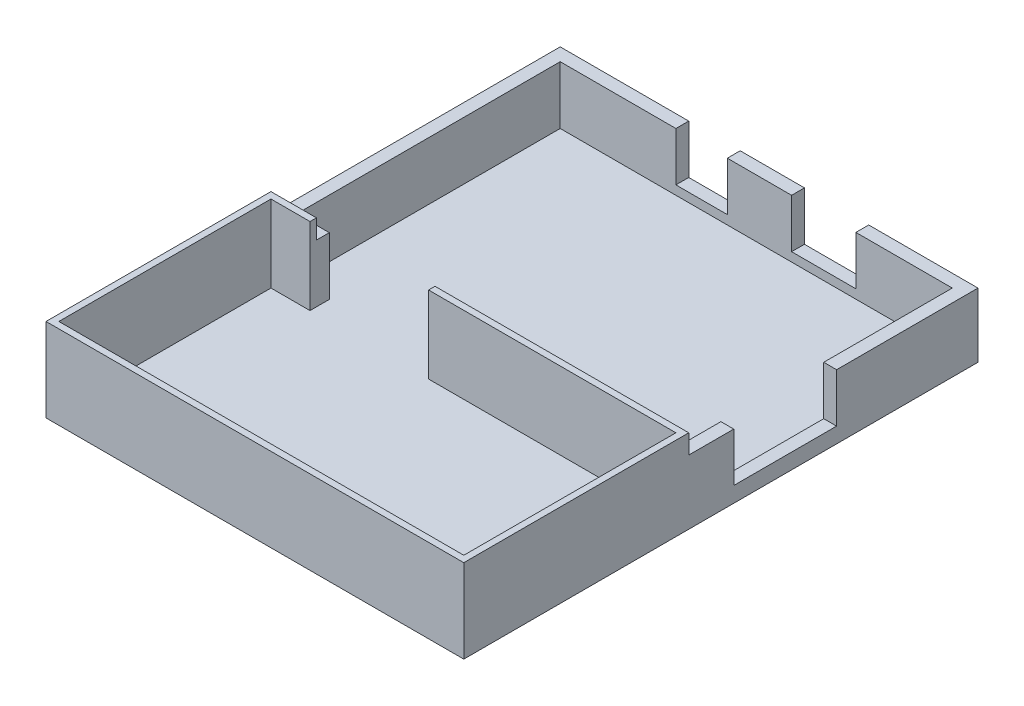
ISO-10303-21;
HEADER;
FILE_DESCRIPTION(('STEP AP214'),'2;1');
FILE_NAME('part.step','',(''),(''),'','','');
FILE_SCHEMA(('AUTOMOTIVE_DESIGN { 1 0 10303 214 1 1 1 1 }'));
ENDSEC;
DATA;
#1=APPLICATION_CONTEXT('core data for automotive mechanical design processes');
#2=APPLICATION_PROTOCOL_DEFINITION('international standard','automotive_design',2000,#1);
#3=PRODUCT_CONTEXT('',#1,'mechanical');
#4=PRODUCT('Part','Part','',(#3));
#5=PRODUCT_RELATED_PRODUCT_CATEGORY('part','',(#4));
#6=PRODUCT_DEFINITION_FORMATION('','',#4);
#7=PRODUCT_DEFINITION_CONTEXT('part definition',#1,'design');
#8=PRODUCT_DEFINITION('design','',#6,#7);
#9=PRODUCT_DEFINITION_SHAPE('','',#8);
#10=(LENGTH_UNIT() NAMED_UNIT(*) SI_UNIT(.MILLI.,.METRE.));
#11=(NAMED_UNIT(*) PLANE_ANGLE_UNIT() SI_UNIT($,.RADIAN.));
#12=(NAMED_UNIT(*) SI_UNIT($,.STERADIAN.) SOLID_ANGLE_UNIT());
#13=UNCERTAINTY_MEASURE_WITH_UNIT(LENGTH_MEASURE(1.E-05),#10,'distance_accuracy_value','');
#14=(GEOMETRIC_REPRESENTATION_CONTEXT(3) GLOBAL_UNCERTAINTY_ASSIGNED_CONTEXT((#13)) GLOBAL_UNIT_ASSIGNED_CONTEXT((#10,
#11,#12)) REPRESENTATION_CONTEXT('',''));
#15=CARTESIAN_POINT('',(0.,0.,0.));
#16=DIRECTION('',(0.,0.,1.));
#17=DIRECTION('',(1.,0.,0.));
#18=AXIS2_PLACEMENT_3D('',#15,#16,#17);
#19=CARTESIAN_POINT('',(0.,10.,0.));
#20=DIRECTION('',(0.,-1.,0.));
#21=DIRECTION('',(0.,0.,-1.));
#22=AXIS2_PLACEMENT_3D('',#19,#20,#21);
#23=PLANE('',#22);
#24=DIRECTION('',(-1.,0.,0.));
#25=VECTOR('',#24,1.);
#26=CARTESIAN_POINT('',(30.5,10.,20.5));
#27=LINE('',#26,#25);
#28=CARTESIAN_POINT('',(30.5,10.,20.5));
#29=VERTEX_POINT('',#28);
#30=CARTESIAN_POINT('',(-6.97753872923101,10.,20.5));
#31=VERTEX_POINT('',#30);
#32=EDGE_CURVE('E402',#29,#31,#27,.T.);
#33=ORIENTED_EDGE('',*,*,#32,.T.);
#34=DIRECTION('',(0.,0.,1.));
#35=VECTOR('',#34,1.);
#36=CARTESIAN_POINT('',(-6.97753872923101,10.,0.));
#37=LINE('',#36,#35);
#38=CARTESIAN_POINT('',(-6.97753872923101,10.,22.5));
#39=VERTEX_POINT('',#38);
#40=EDGE_CURVE('E469',#31,#39,#37,.T.);
#41=ORIENTED_EDGE('',*,*,#40,.T.);
#42=DIRECTION('',(-1.,0.,0.));
#43=VECTOR('',#42,1.);
#44=CARTESIAN_POINT('',(32.5,10.,22.5));
#45=LINE('',#44,#43);
#46=CARTESIAN_POINT('',(32.5,10.,22.5));
#47=VERTEX_POINT('',#46);
#48=EDGE_CURVE('E434',#47,#39,#45,.T.);
#49=ORIENTED_EDGE('',*,*,#48,.F.);
#50=DIRECTION('',(0.,0.,1.));
#51=VECTOR('',#50,1.);
#52=CARTESIAN_POINT('',(32.5,10.,-22.5));
#53=LINE('',#52,#51);
#54=CARTESIAN_POINT('',(32.5,10.,15.5));
#55=VERTEX_POINT('',#54);
#56=EDGE_CURVE('E428',#55,#47,#53,.T.);
#57=ORIENTED_EDGE('',*,*,#56,.F.);
#58=DIRECTION('',(1.,0.,0.));
#59=VECTOR('',#58,1.);
#60=CARTESIAN_POINT('',(32.5,10.,15.5));
#61=LINE('',#60,#59);
#62=CARTESIAN_POINT('',(30.5,10.,15.5));
#63=VERTEX_POINT('',#62);
#64=EDGE_CURVE('E317',#63,#55,#61,.T.);
#65=ORIENTED_EDGE('',*,*,#64,.F.);
#66=DIRECTION('',(0.,0.,1.));
#67=VECTOR('',#66,1.);
#68=CARTESIAN_POINT('',(30.5,10.,-20.5));
#69=LINE('',#68,#67);
#70=EDGE_CURVE('E396',#63,#29,#69,.T.);
#71=ORIENTED_EDGE('',*,*,#70,.T.);
#72=EDGE_LOOP('',(#33,#41,#49,#57,#65,#71));
#73=FACE_BOUND('',#72,.T.);
#74=ADVANCED_FACE('F36',(#73),#23,.F.);
#75=CARTESIAN_POINT('',(30.5,10.,20.5));
#76=DIRECTION('',(0.,0.,1.));
#77=DIRECTION('',(1.,0.,0.));
#78=AXIS2_PLACEMENT_3D('',#75,#76,#77);
#79=PLANE('',#78);
#80=DIRECTION('',(1.,0.,0.));
#81=VECTOR('',#80,1.);
#82=CARTESIAN_POINT('',(-30.5,1.,20.5));
#83=LINE('',#82,#81);
#84=CARTESIAN_POINT('',(-6.97753872923101,1.,20.5));
#85=VERTEX_POINT('',#84);
#86=CARTESIAN_POINT('',(30.5,0.999999999999999,20.5));
#87=VERTEX_POINT('',#86);
#88=EDGE_CURVE('E44',#85,#87,#83,.T.);
#89=ORIENTED_EDGE('',*,*,#88,.F.);
#90=DIRECTION('',(0.,1.,0.));
#91=VECTOR('',#90,1.);
#92=CARTESIAN_POINT('',(-6.97753872923101,10.,20.5));
#93=LINE('',#92,#91);
#94=EDGE_CURVE('E251',#85,#31,#93,.T.);
#95=ORIENTED_EDGE('',*,*,#94,.T.);
#96=ORIENTED_EDGE('',*,*,#32,.F.);
#97=DIRECTION('',(0.,-1.,0.));
#98=VECTOR('',#97,1.);
#99=CARTESIAN_POINT('',(30.5,10.,20.5));
#100=LINE('',#99,#98);
#101=EDGE_CURVE('E416',#29,#87,#100,.T.);
#102=ORIENTED_EDGE('',*,*,#101,.T.);
#103=EDGE_LOOP('',(#89,#95,#96,#102));
#104=FACE_BOUND('',#103,.T.);
#105=ADVANCED_FACE('F465',(#104),#79,.F.);
#106=CARTESIAN_POINT('',(32.5,13.,22.5));
#107=DIRECTION('',(0.,0.,1.));
#108=DIRECTION('',(1.,0.,0.));
#109=AXIS2_PLACEMENT_3D('',#106,#107,#108);
#110=PLANE('',#109);
#111=ORIENTED_EDGE('',*,*,#48,.T.);
#112=DIRECTION('',(0.,1.,0.));
#113=VECTOR('',#112,1.);
#114=CARTESIAN_POINT('',(-6.97753872923101,13.,22.5));
#115=LINE('',#114,#113);
#116=CARTESIAN_POINT('',(-6.97753872923101,13.,22.5));
#117=VERTEX_POINT('',#116);
#118=EDGE_CURVE('E525',#39,#117,#115,.T.);
#119=ORIENTED_EDGE('',*,*,#118,.T.);
#120=DIRECTION('',(-1.,0.,0.));
#121=VECTOR('',#120,1.);
#122=CARTESIAN_POINT('',(32.5,13.,22.5));
#123=LINE('',#122,#121);
#124=CARTESIAN_POINT('',(32.5,13.,22.5));
#125=VERTEX_POINT('',#124);
#126=EDGE_CURVE('E294',#125,#117,#123,.T.);
#127=ORIENTED_EDGE('',*,*,#126,.F.);
#128=DIRECTION('',(0.,-1.,0.));
#129=VECTOR('',#128,1.);
#130=CARTESIAN_POINT('',(32.5,13.,22.5));
#131=LINE('',#130,#129);
#132=EDGE_CURVE('E306',#125,#47,#131,.T.);
#133=ORIENTED_EDGE('',*,*,#132,.T.);
#134=EDGE_LOOP('',(#111,#119,#127,#133));
#135=FACE_BOUND('',#134,.T.);
#136=ADVANCED_FACE('F539',(#135),#110,.F.);
#137=CARTESIAN_POINT('',(31.5,13.,23.5));
#138=DIRECTION('',(0.,0.,1.));
#139=DIRECTION('',(1.,0.,0.));
#140=AXIS2_PLACEMENT_3D('',#137,#138,#139);
#141=PLANE('',#140);
#142=DIRECTION('',(0.,1.,0.));
#143=VECTOR('',#142,1.);
#144=CARTESIAN_POINT('',(-6.97753872923101,-18.9614038762088,23.5));
#145=LINE('',#144,#143);
#146=CARTESIAN_POINT('',(-6.97753872923101,1.,23.5));
#147=VERTEX_POINT('',#146);
#148=CARTESIAN_POINT('',(-6.97753872923101,13.,23.5));
#149=VERTEX_POINT('',#148);
#150=EDGE_CURVE('E248',#147,#149,#145,.T.);
#151=ORIENTED_EDGE('',*,*,#150,.F.);
#152=DIRECTION('',(-1.,0.,0.));
#153=VECTOR('',#152,1.);
#154=CARTESIAN_POINT('',(31.5,0.999999999999999,23.5));
#155=LINE('',#154,#153);
#156=CARTESIAN_POINT('',(31.5,0.999999999999999,23.5));
#157=VERTEX_POINT('',#156);
#158=EDGE_CURVE('E260',#157,#147,#155,.T.);
#159=ORIENTED_EDGE('',*,*,#158,.F.);
#160=DIRECTION('',(0.,-1.,0.));
#161=VECTOR('',#160,1.);
#162=CARTESIAN_POINT('',(31.5,13.,23.5));
#163=LINE('',#162,#161);
#164=CARTESIAN_POINT('',(31.5,13.,23.5));
#165=VERTEX_POINT('',#164);
#166=EDGE_CURVE('E59',#165,#157,#163,.T.);
#167=ORIENTED_EDGE('',*,*,#166,.F.);
#168=DIRECTION('',(-1.,0.,0.));
#169=VECTOR('',#168,1.);
#170=CARTESIAN_POINT('',(31.5,13.,23.5));
#171=LINE('',#170,#169);
#172=EDGE_CURVE('E263',#165,#149,#171,.T.);
#173=ORIENTED_EDGE('',*,*,#172,.T.);
#174=EDGE_LOOP('',(#151,#159,#167,#173));
#175=FACE_BOUND('',#174,.T.);
#176=ADVANCED_FACE('F259',(#175),#141,.T.);
#177=CARTESIAN_POINT('',(30.5,10.,-20.5));
#178=VERTEX_POINT('',#177);
#179=CARTESIAN_POINT('',(30.5,10.,-0.5));
#180=VERTEX_POINT('',#179);
#181=EDGE_CURVE('E398',#178,#180,#69,.T.);
#182=ORIENTED_EDGE('',*,*,#181,.T.);
#183=DIRECTION('',(-1.,0.,0.));
#184=VECTOR('',#183,1.);
#185=CARTESIAN_POINT('',(32.5,10.,-0.5));
#186=LINE('',#185,#184);
#187=CARTESIAN_POINT('',(32.5,10.,-0.5));
#188=VERTEX_POINT('',#187);
#189=EDGE_CURVE('E316',#188,#180,#186,.T.);
#190=ORIENTED_EDGE('',*,*,#189,.F.);
#191=CARTESIAN_POINT('',(32.5,10.,-22.5));
#192=VERTEX_POINT('',#191);
#193=EDGE_CURVE('E430',#192,#188,#53,.T.);
#194=ORIENTED_EDGE('',*,*,#193,.F.);
#195=DIRECTION('',(1.,0.,0.));
#196=VECTOR('',#195,1.);
#197=CARTESIAN_POINT('',(-32.5,10.,-22.5));
#198=LINE('',#197,#196);
#199=CARTESIAN_POINT('',(15.5,10.,-22.5));
#200=VERTEX_POINT('',#199);
#201=EDGE_CURVE('E423',#200,#192,#198,.T.);
#202=ORIENTED_EDGE('',*,*,#201,.F.);
#203=DIRECTION('',(0.,0.,-1.));
#204=VECTOR('',#203,1.);
#205=CARTESIAN_POINT('',(15.5,10.,-22.5));
#206=LINE('',#205,#204);
#207=CARTESIAN_POINT('',(15.5,10.,-20.5));
#208=VERTEX_POINT('',#207);
#209=EDGE_CURVE('E343',#208,#200,#206,.T.);
#210=ORIENTED_EDGE('',*,*,#209,.F.);
#211=DIRECTION('',(1.,0.,0.));
#212=VECTOR('',#211,1.);
#213=CARTESIAN_POINT('',(-30.5,10.,-20.5));
#214=LINE('',#213,#212);
#215=EDGE_CURVE('E392',#208,#178,#214,.T.);
#216=ORIENTED_EDGE('',*,*,#215,.T.);
#217=EDGE_LOOP('',(#182,#190,#194,#202,#210,#216));
#218=FACE_BOUND('',#217,.T.);
#219=ADVANCED_FACE('F483',(#218),#23,.F.);
#220=CARTESIAN_POINT('',(-25.428302151596,10.,22.5));
#221=VERTEX_POINT('',#220);
#222=CARTESIAN_POINT('',(-32.5,10.,22.5));
#223=VERTEX_POINT('',#222);
#224=EDGE_CURVE('E433',#221,#223,#45,.T.);
#225=ORIENTED_EDGE('',*,*,#224,.F.);
#226=DIRECTION('',(0.,0.,-1.));
#227=VECTOR('',#226,1.);
#228=CARTESIAN_POINT('',(-25.428302151596,10.,0.));
#229=LINE('',#228,#227);
#230=CARTESIAN_POINT('',(-25.428302151596,10.,20.5));
#231=VERTEX_POINT('',#230);
#232=EDGE_CURVE('E529',#221,#231,#229,.T.);
#233=ORIENTED_EDGE('',*,*,#232,.T.);
#234=CARTESIAN_POINT('',(-30.5,10.,20.5));
#235=VERTEX_POINT('',#234);
#236=EDGE_CURVE('E401',#231,#235,#27,.T.);
#237=ORIENTED_EDGE('',*,*,#236,.T.);
#238=DIRECTION('',(0.,0.,-1.));
#239=VECTOR('',#238,1.);
#240=CARTESIAN_POINT('',(-30.5,10.,20.5));
#241=LINE('',#240,#239);
#242=CARTESIAN_POINT('',(-30.5,10.,-20.5));
#243=VERTEX_POINT('',#242);
#244=EDGE_CURVE('E405',#235,#243,#241,.T.);
#245=ORIENTED_EDGE('',*,*,#244,.T.);
#246=CARTESIAN_POINT('',(-12.5,10.,-20.5));
#247=VERTEX_POINT('',#246);
#248=EDGE_CURVE('E393',#243,#247,#214,.T.);
#249=ORIENTED_EDGE('',*,*,#248,.T.);
#250=DIRECTION('',(0.,0.,1.));
#251=VECTOR('',#250,1.);
#252=CARTESIAN_POINT('',(-12.5,10.,-22.5));
#253=LINE('',#252,#251);
#254=CARTESIAN_POINT('',(-12.5,10.,-22.5));
#255=VERTEX_POINT('',#254);
#256=EDGE_CURVE('E367',#255,#247,#253,.T.);
#257=ORIENTED_EDGE('',*,*,#256,.F.);
#258=CARTESIAN_POINT('',(-32.5,10.,-22.5));
#259=VERTEX_POINT('',#258);
#260=EDGE_CURVE('E425',#259,#255,#198,.T.);
#261=ORIENTED_EDGE('',*,*,#260,.F.);
#262=DIRECTION('',(0.,0.,-1.));
#263=VECTOR('',#262,1.);
#264=CARTESIAN_POINT('',(-32.5,10.,22.5));
#265=LINE('',#264,#263);
#266=EDGE_CURVE('E420',#223,#259,#265,.T.);
#267=ORIENTED_EDGE('',*,*,#266,.F.);
#268=EDGE_LOOP('',(#225,#233,#237,#245,#249,#257,#261,#267));
#269=FACE_BOUND('',#268,.T.);
#270=ADVANCED_FACE('F590',(#269),#23,.F.);
#271=CARTESIAN_POINT('',(0.,1.,0.));
#272=DIRECTION('',(0.,-1.,0.));
#273=DIRECTION('',(0.,0.,-1.));
#274=AXIS2_PLACEMENT_3D('',#271,#272,#273);
#275=PLANE('',#274);
#276=DIRECTION('',(0.,0.,-1.));
#277=VECTOR('',#276,1.);
#278=CARTESIAN_POINT('',(-6.97753872923101,1.,23.5));
#279=LINE('',#278,#277);
#280=EDGE_CURVE('E245',#147,#85,#279,.T.);
#281=ORIENTED_EDGE('',*,*,#280,.T.);
#282=ORIENTED_EDGE('',*,*,#88,.T.);
#283=DIRECTION('',(0.,0.,-1.));
#284=VECTOR('',#283,1.);
#285=CARTESIAN_POINT('',(30.5,1.,20.5));
#286=LINE('',#285,#284);
#287=CARTESIAN_POINT('',(30.5,1.,-20.5));
#288=VERTEX_POINT('',#287);
#289=EDGE_CURVE('E446',#87,#288,#286,.T.);
#290=ORIENTED_EDGE('',*,*,#289,.T.);
#291=DIRECTION('',(-1.,0.,0.));
#292=VECTOR('',#291,1.);
#293=CARTESIAN_POINT('',(-30.5,1.,-20.5));
#294=LINE('',#293,#292);
#295=CARTESIAN_POINT('',(-30.5,0.999999999999999,-20.5));
#296=VERTEX_POINT('',#295);
#297=EDGE_CURVE('E450',#288,#296,#294,.T.);
#298=ORIENTED_EDGE('',*,*,#297,.T.);
#299=DIRECTION('',(0.,0.,1.));
#300=VECTOR('',#299,1.);
#301=CARTESIAN_POINT('',(-30.5,1.,20.5));
#302=LINE('',#301,#300);
#303=CARTESIAN_POINT('',(-30.5,0.999999999999999,20.5));
#304=VERTEX_POINT('',#303);
#305=EDGE_CURVE('E452',#296,#304,#302,.T.);
#306=ORIENTED_EDGE('',*,*,#305,.T.);
#307=CARTESIAN_POINT('',(-25.428302151596,1.,20.5));
#308=VERTEX_POINT('',#307);
#309=EDGE_CURVE('E13',#304,#308,#83,.T.);
#310=ORIENTED_EDGE('',*,*,#309,.T.);
#311=DIRECTION('',(0.,0.,1.));
#312=VECTOR('',#311,1.);
#313=CARTESIAN_POINT('',(-25.428302151596,1.,23.5));
#314=LINE('',#313,#312);
#315=CARTESIAN_POINT('',(-25.428302151596,1.,23.5));
#316=VERTEX_POINT('',#315);
#317=EDGE_CURVE('E255',#308,#316,#314,.T.);
#318=ORIENTED_EDGE('',*,*,#317,.T.);
#319=CARTESIAN_POINT('',(-31.5,1.,23.5));
#320=VERTEX_POINT('',#319);
#321=EDGE_CURVE('E270',#316,#320,#155,.T.);
#322=ORIENTED_EDGE('',*,*,#321,.T.);
#323=DIRECTION('',(0.,0.,1.));
#324=VECTOR('',#323,1.);
#325=CARTESIAN_POINT('',(-31.5,1.,23.5));
#326=LINE('',#325,#324);
#327=CARTESIAN_POINT('',(-31.5,1.,56.5));
#328=VERTEX_POINT('',#327);
#329=EDGE_CURVE('E269',#320,#328,#326,.T.);
#330=ORIENTED_EDGE('',*,*,#329,.T.);
#331=DIRECTION('',(1.,0.,0.));
#332=VECTOR('',#331,1.);
#333=CARTESIAN_POINT('',(-31.5,1.,56.5));
#334=LINE('',#333,#332);
#335=CARTESIAN_POINT('',(31.5,0.999999999999999,56.5));
#336=VERTEX_POINT('',#335);
#337=EDGE_CURVE('E273',#328,#336,#334,.T.);
#338=ORIENTED_EDGE('',*,*,#337,.T.);
#339=DIRECTION('',(0.,0.,-1.));
#340=VECTOR('',#339,1.);
#341=CARTESIAN_POINT('',(31.5,0.999999999999999,56.5));
#342=LINE('',#341,#340);
#343=EDGE_CURVE('E268',#336,#157,#342,.T.);
#344=ORIENTED_EDGE('',*,*,#343,.T.);
#345=ORIENTED_EDGE('',*,*,#158,.T.);
#346=EDGE_LOOP('',(#281,#282,#290,#298,#306,#310,#318,#322,#330,#338,#344,#345));
#347=FACE_BOUND('',#346,.T.);
#348=ADVANCED_FACE('F266',(#347),#275,.F.);
#349=CARTESIAN_POINT('',(-30.5,10.,-20.5));
#350=DIRECTION('',(0.,0.,-1.));
#351=DIRECTION('',(-1.,0.,0.));
#352=AXIS2_PLACEMENT_3D('',#349,#350,#351);
#353=PLANE('',#352);
#354=ORIENTED_EDGE('',*,*,#215,.F.);
#355=DIRECTION('',(0.,1.,0.));
#356=VECTOR('',#355,1.);
#357=CARTESIAN_POINT('',(15.5,-15.1245154965971,-20.5));
#358=LINE('',#357,#356);
#359=CARTESIAN_POINT('',(15.5,2.39999999999999,-20.5));
#360=VERTEX_POINT('',#359);
#361=EDGE_CURVE('E349',#360,#208,#358,.T.);
#362=ORIENTED_EDGE('',*,*,#361,.F.);
#363=DIRECTION('',(1.,0.,0.));
#364=VECTOR('',#363,1.);
#365=CARTESIAN_POINT('',(5.5,2.4,-20.5));
#366=LINE('',#365,#364);
#367=CARTESIAN_POINT('',(5.5,2.4,-20.5));
#368=VERTEX_POINT('',#367);
#369=EDGE_CURVE('E345',#368,#360,#366,.T.);
#370=ORIENTED_EDGE('',*,*,#369,.F.);
#371=DIRECTION('',(0.,1.,0.));
#372=VECTOR('',#371,1.);
#373=CARTESIAN_POINT('',(5.5,-15.1245154965971,-20.5));
#374=LINE('',#373,#372);
#375=CARTESIAN_POINT('',(5.5,10.,-20.5));
#376=VERTEX_POINT('',#375);
#377=EDGE_CURVE('E352',#368,#376,#374,.T.);
#378=ORIENTED_EDGE('',*,*,#377,.T.);
#379=CARTESIAN_POINT('',(-4.5,10.,-20.5));
#380=VERTEX_POINT('',#379);
#381=EDGE_CURVE('E397',#380,#376,#214,.T.);
#382=ORIENTED_EDGE('',*,*,#381,.F.);
#383=DIRECTION('',(0.,1.,0.));
#384=VECTOR('',#383,1.);
#385=CARTESIAN_POINT('',(-4.5,-15.1245154965971,-20.5));
#386=LINE('',#385,#384);
#387=CARTESIAN_POINT('',(-4.5,2.39999999999999,-20.5));
#388=VERTEX_POINT('',#387);
#389=EDGE_CURVE('E374',#388,#380,#386,.T.);
#390=ORIENTED_EDGE('',*,*,#389,.F.);
#391=DIRECTION('',(1.,0.,0.));
#392=VECTOR('',#391,1.);
#393=CARTESIAN_POINT('',(-12.5,2.4,-20.5));
#394=LINE('',#393,#392);
#395=CARTESIAN_POINT('',(-12.5,2.4,-20.5));
#396=VERTEX_POINT('',#395);
#397=EDGE_CURVE('E370',#396,#388,#394,.T.);
#398=ORIENTED_EDGE('',*,*,#397,.F.);
#399=DIRECTION('',(0.,1.,0.));
#400=VECTOR('',#399,1.);
#401=CARTESIAN_POINT('',(-12.5,-15.1245154965971,-20.5));
#402=LINE('',#401,#400);
#403=EDGE_CURVE('E377',#396,#247,#402,.T.);
#404=ORIENTED_EDGE('',*,*,#403,.T.);
#405=ORIENTED_EDGE('',*,*,#248,.F.);
#406=DIRECTION('',(0.,-1.,0.));
#407=VECTOR('',#406,1.);
#408=CARTESIAN_POINT('',(-30.5,10.,-20.5));
#409=LINE('',#408,#407);
#410=EDGE_CURVE('E409',#243,#296,#409,.T.);
#411=ORIENTED_EDGE('',*,*,#410,.T.);
#412=ORIENTED_EDGE('',*,*,#297,.F.);
#413=DIRECTION('',(0.,-1.,0.));
#414=VECTOR('',#413,1.);
#415=CARTESIAN_POINT('',(30.5,10.,-20.5));
#416=LINE('',#415,#414);
#417=EDGE_CURVE('E408',#178,#288,#416,.T.);
#418=ORIENTED_EDGE('',*,*,#417,.F.);
#419=EDGE_LOOP('',(#354,#362,#370,#378,#382,#390,#398,#404,#405,#411,#412,#418));
#420=FACE_BOUND('',#419,.T.);
#421=ADVANCED_FACE('F490',(#420),#353,.F.);
#422=CARTESIAN_POINT('',(-30.5,10.,20.5));
#423=DIRECTION('',(-1.,0.,0.));
#424=DIRECTION('',(0.,0.,1.));
#425=AXIS2_PLACEMENT_3D('',#422,#423,#424);
#426=PLANE('',#425);
#427=DIRECTION('',(0.,-1.,0.));
#428=VECTOR('',#427,1.);
#429=CARTESIAN_POINT('',(-30.5,10.,20.5));
#430=LINE('',#429,#428);
#431=EDGE_CURVE('E413',#235,#304,#430,.T.);
#432=ORIENTED_EDGE('',*,*,#431,.T.);
#433=ORIENTED_EDGE('',*,*,#305,.F.);
#434=ORIENTED_EDGE('',*,*,#410,.F.);
#435=ORIENTED_EDGE('',*,*,#244,.F.);
#436=EDGE_LOOP('',(#432,#433,#434,#435));
#437=FACE_BOUND('',#436,.T.);
#438=ADVANCED_FACE('F494',(#437),#426,.F.);
#439=ORIENTED_EDGE('',*,*,#236,.F.);
#440=DIRECTION('',(0.,-1.,0.));
#441=VECTOR('',#440,1.);
#442=CARTESIAN_POINT('',(-25.428302151596,10.,20.5));
#443=LINE('',#442,#441);
#444=EDGE_CURVE('E500',#231,#308,#443,.T.);
#445=ORIENTED_EDGE('',*,*,#444,.T.);
#446=ORIENTED_EDGE('',*,*,#309,.F.);
#447=ORIENTED_EDGE('',*,*,#431,.F.);
#448=EDGE_LOOP('',(#439,#445,#446,#447));
#449=FACE_BOUND('',#448,.T.);
#450=ADVANCED_FACE('F498',(#449),#79,.F.);
#451=CARTESIAN_POINT('',(30.5,10.,-20.5));
#452=DIRECTION('',(1.,0.,0.));
#453=DIRECTION('',(0.,0.,-1.));
#454=AXIS2_PLACEMENT_3D('',#451,#452,#453);
#455=PLANE('',#454);
#456=DIRECTION('',(0.,0.,1.));
#457=VECTOR('',#456,1.);
#458=CARTESIAN_POINT('',(30.5,2.4,15.5));
#459=LINE('',#458,#457);
#460=CARTESIAN_POINT('',(30.5,2.39999999999999,-0.5));
#461=VERTEX_POINT('',#460);
#462=CARTESIAN_POINT('',(30.5,2.4,15.5));
#463=VERTEX_POINT('',#462);
#464=EDGE_CURVE('E333',#461,#463,#459,.T.);
#465=ORIENTED_EDGE('',*,*,#464,.F.);
#466=DIRECTION('',(0.,1.,0.));
#467=VECTOR('',#466,1.);
#468=CARTESIAN_POINT('',(30.5,-15.1245154965971,-0.5));
#469=LINE('',#468,#467);
#470=EDGE_CURVE('E323',#461,#180,#469,.T.);
#471=ORIENTED_EDGE('',*,*,#470,.T.);
#472=ORIENTED_EDGE('',*,*,#181,.F.);
#473=ORIENTED_EDGE('',*,*,#417,.T.);
#474=ORIENTED_EDGE('',*,*,#289,.F.);
#475=ORIENTED_EDGE('',*,*,#101,.F.);
#476=ORIENTED_EDGE('',*,*,#70,.F.);
#477=DIRECTION('',(0.,1.,0.));
#478=VECTOR('',#477,1.);
#479=CARTESIAN_POINT('',(30.5,-15.1245154965971,15.5));
#480=LINE('',#479,#478);
#481=EDGE_CURVE('E332',#463,#63,#480,.T.);
#482=ORIENTED_EDGE('',*,*,#481,.F.);
#483=EDGE_LOOP('',(#465,#471,#472,#473,#474,#475,#476,#482));
#484=FACE_BOUND('',#483,.T.);
#485=ADVANCED_FACE('F459',(#484),#455,.F.);
#486=CARTESIAN_POINT('',(-32.5,10.,22.5));
#487=DIRECTION('',(-1.,0.,0.));
#488=DIRECTION('',(0.,0.,1.));
#489=AXIS2_PLACEMENT_3D('',#486,#487,#488);
#490=PLANE('',#489);
#491=DIRECTION('',(0.,0.,-1.));
#492=VECTOR('',#491,1.);
#493=CARTESIAN_POINT('',(-32.5,0.,22.5));
#494=LINE('',#493,#492);
#495=CARTESIAN_POINT('',(-32.5,0.,57.5));
#496=VERTEX_POINT('',#495);
#497=CARTESIAN_POINT('',(-32.5,0.,-22.5));
#498=VERTEX_POINT('',#497);
#499=EDGE_CURVE('E412',#496,#498,#494,.T.);
#500=ORIENTED_EDGE('',*,*,#499,.F.);
#501=DIRECTION('',(0.,-1.,0.));
#502=VECTOR('',#501,1.);
#503=CARTESIAN_POINT('',(-32.5,0.,57.5));
#504=LINE('',#503,#502);
#505=CARTESIAN_POINT('',(-32.5,13.,57.5));
#506=VERTEX_POINT('',#505);
#507=EDGE_CURVE('E308',#506,#496,#504,.T.);
#508=ORIENTED_EDGE('',*,*,#507,.F.);
#509=DIRECTION('',(0.,0.,1.));
#510=VECTOR('',#509,1.);
#511=CARTESIAN_POINT('',(-32.5,13.,22.5));
#512=LINE('',#511,#510);
#513=CARTESIAN_POINT('',(-32.5,13.,22.5));
#514=VERTEX_POINT('',#513);
#515=EDGE_CURVE('E297',#514,#506,#512,.T.);
#516=ORIENTED_EDGE('',*,*,#515,.F.);
#517=DIRECTION('',(0.,-1.,0.));
#518=VECTOR('',#517,1.);
#519=CARTESIAN_POINT('',(-32.5,13.,22.5));
#520=LINE('',#519,#518);
#521=EDGE_CURVE('E303',#514,#223,#520,.T.);
#522=ORIENTED_EDGE('',*,*,#521,.T.);
#523=ORIENTED_EDGE('',*,*,#266,.T.);
#524=DIRECTION('',(0.,-1.,0.));
#525=VECTOR('',#524,1.);
#526=CARTESIAN_POINT('',(-32.5,10.,-22.5));
#527=LINE('',#526,#525);
#528=EDGE_CURVE('E437',#259,#498,#527,.T.);
#529=ORIENTED_EDGE('',*,*,#528,.T.);
#530=EDGE_LOOP('',(#500,#508,#516,#522,#523,#529));
#531=FACE_BOUND('',#530,.T.);
#532=ADVANCED_FACE('F615',(#531),#490,.T.);
#533=CARTESIAN_POINT('',(32.5,10.,-22.5));
#534=DIRECTION('',(1.,0.,0.));
#535=DIRECTION('',(0.,0.,-1.));
#536=AXIS2_PLACEMENT_3D('',#533,#534,#535);
#537=PLANE('',#536);
#538=DIRECTION('',(0.,1.,0.));
#539=VECTOR('',#538,1.);
#540=CARTESIAN_POINT('',(32.5,-15.1245154965971,-0.5));
#541=LINE('',#540,#539);
#542=CARTESIAN_POINT('',(32.5,2.4,-0.5));
#543=VERTEX_POINT('',#542);
#544=EDGE_CURVE('E327',#543,#188,#541,.T.);
#545=ORIENTED_EDGE('',*,*,#544,.F.);
#546=DIRECTION('',(0.,0.,-1.));
#547=VECTOR('',#546,1.);
#548=CARTESIAN_POINT('',(32.5,2.4,15.5));
#549=LINE('',#548,#547);
#550=CARTESIAN_POINT('',(32.5,2.4,15.5));
#551=VERTEX_POINT('',#550);
#552=EDGE_CURVE('E324',#551,#543,#549,.T.);
#553=ORIENTED_EDGE('',*,*,#552,.F.);
#554=DIRECTION('',(0.,1.,0.));
#555=VECTOR('',#554,1.);
#556=CARTESIAN_POINT('',(32.5,-15.1245154965971,15.5));
#557=LINE('',#556,#555);
#558=EDGE_CURVE('E328',#551,#55,#557,.T.);
#559=ORIENTED_EDGE('',*,*,#558,.T.);
#560=ORIENTED_EDGE('',*,*,#56,.T.);
#561=ORIENTED_EDGE('',*,*,#132,.F.);
#562=DIRECTION('',(0.,0.,-1.));
#563=VECTOR('',#562,1.);
#564=CARTESIAN_POINT('',(32.5,13.,57.5));
#565=LINE('',#564,#563);
#566=CARTESIAN_POINT('',(32.5,13.,57.5));
#567=VERTEX_POINT('',#566);
#568=EDGE_CURVE('E290',#567,#125,#565,.T.);
#569=ORIENTED_EDGE('',*,*,#568,.F.);
#570=DIRECTION('',(0.,1.,0.));
#571=VECTOR('',#570,1.);
#572=CARTESIAN_POINT('',(32.5,0.,57.5));
#573=LINE('',#572,#571);
#574=CARTESIAN_POINT('',(32.5,0.,57.5));
#575=VERTEX_POINT('',#574);
#576=EDGE_CURVE('E314',#575,#567,#573,.T.);
#577=ORIENTED_EDGE('',*,*,#576,.F.);
#578=DIRECTION('',(0.,0.,1.));
#579=VECTOR('',#578,1.);
#580=CARTESIAN_POINT('',(32.5,0.,-22.5));
#581=LINE('',#580,#579);
#582=CARTESIAN_POINT('',(32.5,0.,-22.5));
#583=VERTEX_POINT('',#582);
#584=EDGE_CURVE('E424',#583,#575,#581,.T.);
#585=ORIENTED_EDGE('',*,*,#584,.F.);
#586=DIRECTION('',(0.,-1.,0.));
#587=VECTOR('',#586,1.);
#588=CARTESIAN_POINT('',(32.5,10.,-22.5));
#589=LINE('',#588,#587);
#590=EDGE_CURVE('E444',#192,#583,#589,.T.);
#591=ORIENTED_EDGE('',*,*,#590,.F.);
#592=ORIENTED_EDGE('',*,*,#193,.T.);
#593=EDGE_LOOP('',(#545,#553,#559,#560,#561,#569,#577,#585,#591,#592));
#594=FACE_BOUND('',#593,.T.);
#595=ADVANCED_FACE('F546',(#594),#537,.T.);
#596=CARTESIAN_POINT('',(-32.5,10.,-22.5));
#597=DIRECTION('',(0.,0.,-1.));
#598=DIRECTION('',(-1.,0.,0.));
#599=AXIS2_PLACEMENT_3D('',#596,#597,#598);
#600=PLANE('',#599);
#601=DIRECTION('',(0.,1.,0.));
#602=VECTOR('',#601,1.);
#603=CARTESIAN_POINT('',(15.5,-15.1245154965971,-22.5));
#604=LINE('',#603,#602);
#605=CARTESIAN_POINT('',(15.5,2.4,-22.5));
#606=VERTEX_POINT('',#605);
#607=EDGE_CURVE('E357',#606,#200,#604,.T.);
#608=ORIENTED_EDGE('',*,*,#607,.T.);
#609=ORIENTED_EDGE('',*,*,#201,.T.);
#610=ORIENTED_EDGE('',*,*,#590,.T.);
#611=DIRECTION('',(1.,0.,0.));
#612=VECTOR('',#611,1.);
#613=CARTESIAN_POINT('',(-32.5,0.,-22.5));
#614=LINE('',#613,#612);
#615=EDGE_CURVE('E440',#498,#583,#614,.T.);
#616=ORIENTED_EDGE('',*,*,#615,.F.);
#617=ORIENTED_EDGE('',*,*,#528,.F.);
#618=ORIENTED_EDGE('',*,*,#260,.T.);
#619=DIRECTION('',(0.,1.,0.));
#620=VECTOR('',#619,1.);
#621=CARTESIAN_POINT('',(-12.5,-15.1245154965971,-22.5));
#622=LINE('',#621,#620);
#623=CARTESIAN_POINT('',(-12.5,2.4,-22.5));
#624=VERTEX_POINT('',#623);
#625=EDGE_CURVE('E378',#624,#255,#622,.T.);
#626=ORIENTED_EDGE('',*,*,#625,.F.);
#627=DIRECTION('',(-1.,0.,0.));
#628=VECTOR('',#627,1.);
#629=CARTESIAN_POINT('',(-12.5,2.4,-22.5));
#630=LINE('',#629,#628);
#631=CARTESIAN_POINT('',(-4.5,2.4,-22.5));
#632=VERTEX_POINT('',#631);
#633=EDGE_CURVE('E379',#632,#624,#630,.T.);
#634=ORIENTED_EDGE('',*,*,#633,.F.);
#635=DIRECTION('',(0.,1.,0.));
#636=VECTOR('',#635,1.);
#637=CARTESIAN_POINT('',(-4.5,-15.1245154965971,-22.5));
#638=LINE('',#637,#636);
#639=CARTESIAN_POINT('',(-4.5,10.,-22.5));
#640=VERTEX_POINT('',#639);
#641=EDGE_CURVE('E382',#632,#640,#638,.T.);
#642=ORIENTED_EDGE('',*,*,#641,.T.);
#643=CARTESIAN_POINT('',(5.5,10.,-22.5));
#644=VERTEX_POINT('',#643);
#645=EDGE_CURVE('E429',#640,#644,#198,.T.);
#646=ORIENTED_EDGE('',*,*,#645,.T.);
#647=DIRECTION('',(0.,1.,0.));
#648=VECTOR('',#647,1.);
#649=CARTESIAN_POINT('',(5.5,-15.1245154965971,-22.5));
#650=LINE('',#649,#648);
#651=CARTESIAN_POINT('',(5.5,2.4,-22.5));
#652=VERTEX_POINT('',#651);
#653=EDGE_CURVE('E353',#652,#644,#650,.T.);
#654=ORIENTED_EDGE('',*,*,#653,.F.);
#655=DIRECTION('',(-1.,0.,0.));
#656=VECTOR('',#655,1.);
#657=CARTESIAN_POINT('',(5.5,2.4,-22.5));
#658=LINE('',#657,#656);
#659=EDGE_CURVE('E354',#606,#652,#658,.T.);
#660=ORIENTED_EDGE('',*,*,#659,.F.);
#661=EDGE_LOOP('',(#608,#609,#610,#616,#617,#618,#626,#634,#642,#646,#654,#660));
#662=FACE_BOUND('',#661,.T.);
#663=ADVANCED_FACE('F553',(#662),#600,.T.);
#664=ORIENTED_EDGE('',*,*,#381,.T.);
#665=DIRECTION('',(0.,0.,1.));
#666=VECTOR('',#665,1.);
#667=CARTESIAN_POINT('',(5.5,10.,-22.5));
#668=LINE('',#667,#666);
#669=EDGE_CURVE('E342',#644,#376,#668,.T.);
#670=ORIENTED_EDGE('',*,*,#669,.F.);
#671=ORIENTED_EDGE('',*,*,#645,.F.);
#672=DIRECTION('',(0.,0.,-1.));
#673=VECTOR('',#672,1.);
#674=CARTESIAN_POINT('',(-4.5,10.,-22.5));
#675=LINE('',#674,#673);
#676=EDGE_CURVE('E368',#380,#640,#675,.T.);
#677=ORIENTED_EDGE('',*,*,#676,.F.);
#678=EDGE_LOOP('',(#664,#670,#671,#677));
#679=FACE_BOUND('',#678,.T.);
#680=ADVANCED_FACE('F560',(#679),#23,.F.);
#681=CARTESIAN_POINT('',(0.,0.,0.));
#682=DIRECTION('',(0.,-1.,0.));
#683=DIRECTION('',(0.,0.,-1.));
#684=AXIS2_PLACEMENT_3D('',#681,#682,#683);
#685=PLANE('',#684);
#686=ORIENTED_EDGE('',*,*,#499,.T.);
#687=ORIENTED_EDGE('',*,*,#615,.T.);
#688=ORIENTED_EDGE('',*,*,#584,.T.);
#689=DIRECTION('',(1.,0.,0.));
#690=VECTOR('',#689,1.);
#691=CARTESIAN_POINT('',(-32.5,0.,57.5));
#692=LINE('',#691,#690);
#693=EDGE_CURVE('E311',#496,#575,#692,.T.);
#694=ORIENTED_EDGE('',*,*,#693,.F.);
#695=EDGE_LOOP('',(#686,#687,#688,#694));
#696=FACE_BOUND('',#695,.T.);
#697=ADVANCED_FACE('F38',(#696),#685,.T.);
#698=CARTESIAN_POINT('',(0.,2.4,0.));
#699=DIRECTION('',(0.,-1.,0.));
#700=DIRECTION('',(0.,0.,-1.));
#701=AXIS2_PLACEMENT_3D('',#698,#699,#700);
#702=PLANE('',#701);
#703=DIRECTION('',(0.,0.,1.));
#704=VECTOR('',#703,1.);
#705=CARTESIAN_POINT('',(-12.5,2.4,-22.5));
#706=LINE('',#705,#704);
#707=EDGE_CURVE('E375',#624,#396,#706,.T.);
#708=ORIENTED_EDGE('',*,*,#707,.T.);
#709=ORIENTED_EDGE('',*,*,#397,.T.);
#710=DIRECTION('',(0.,0.,-1.));
#711=VECTOR('',#710,1.);
#712=CARTESIAN_POINT('',(-4.5,2.4,-22.5));
#713=LINE('',#712,#711);
#714=EDGE_CURVE('E383',#388,#632,#713,.T.);
#715=ORIENTED_EDGE('',*,*,#714,.T.);
#716=ORIENTED_EDGE('',*,*,#633,.T.);
#717=EDGE_LOOP('',(#708,#709,#715,#716));
#718=FACE_BOUND('',#717,.T.);
#719=ADVANCED_FACE('F596',(#718),#702,.F.);
#720=CARTESIAN_POINT('',(-4.5,-15.1245154965971,-22.5));
#721=DIRECTION('',(1.,0.,0.));
#722=DIRECTION('',(0.,0.,-1.));
#723=AXIS2_PLACEMENT_3D('',#720,#721,#722);
#724=PLANE('',#723);
#725=ORIENTED_EDGE('',*,*,#389,.T.);
#726=ORIENTED_EDGE('',*,*,#676,.T.);
#727=ORIENTED_EDGE('',*,*,#641,.F.);
#728=ORIENTED_EDGE('',*,*,#714,.F.);
#729=EDGE_LOOP('',(#725,#726,#727,#728));
#730=FACE_BOUND('',#729,.T.);
#731=ADVANCED_FACE('F627',(#730),#724,.F.);
#732=CARTESIAN_POINT('',(-12.5,-15.1245154965971,-22.5));
#733=DIRECTION('',(-1.,0.,0.));
#734=DIRECTION('',(0.,0.,1.));
#735=AXIS2_PLACEMENT_3D('',#732,#733,#734);
#736=PLANE('',#735);
#737=ORIENTED_EDGE('',*,*,#625,.T.);
#738=ORIENTED_EDGE('',*,*,#256,.T.);
#739=ORIENTED_EDGE('',*,*,#403,.F.);
#740=ORIENTED_EDGE('',*,*,#707,.F.);
#741=EDGE_LOOP('',(#737,#738,#739,#740));
#742=FACE_BOUND('',#741,.T.);
#743=ADVANCED_FACE('F578',(#742),#736,.F.);
#744=CARTESIAN_POINT('',(0.,2.4,0.));
#745=DIRECTION('',(0.,-1.,0.));
#746=DIRECTION('',(0.,0.,-1.));
#747=AXIS2_PLACEMENT_3D('',#744,#745,#746);
#748=PLANE('',#747);
#749=DIRECTION('',(0.,0.,1.));
#750=VECTOR('',#749,1.);
#751=CARTESIAN_POINT('',(5.5,2.4,-22.5));
#752=LINE('',#751,#750);
#753=EDGE_CURVE('E350',#652,#368,#752,.T.);
#754=ORIENTED_EDGE('',*,*,#753,.T.);
#755=ORIENTED_EDGE('',*,*,#369,.T.);
#756=DIRECTION('',(0.,0.,-1.));
#757=VECTOR('',#756,1.);
#758=CARTESIAN_POINT('',(15.5,2.4,-22.5));
#759=LINE('',#758,#757);
#760=EDGE_CURVE('E358',#360,#606,#759,.T.);
#761=ORIENTED_EDGE('',*,*,#760,.T.);
#762=ORIENTED_EDGE('',*,*,#659,.T.);
#763=EDGE_LOOP('',(#754,#755,#761,#762));
#764=FACE_BOUND('',#763,.T.);
#765=ADVANCED_FACE('F568',(#764),#748,.F.);
#766=CARTESIAN_POINT('',(15.5,-15.1245154965971,-22.5));
#767=DIRECTION('',(1.,0.,0.));
#768=DIRECTION('',(0.,0.,-1.));
#769=AXIS2_PLACEMENT_3D('',#766,#767,#768);
#770=PLANE('',#769);
#771=ORIENTED_EDGE('',*,*,#361,.T.);
#772=ORIENTED_EDGE('',*,*,#209,.T.);
#773=ORIENTED_EDGE('',*,*,#607,.F.);
#774=ORIENTED_EDGE('',*,*,#760,.F.);
#775=EDGE_LOOP('',(#771,#772,#773,#774));
#776=FACE_BOUND('',#775,.T.);
#777=ADVANCED_FACE('F570',(#776),#770,.F.);
#778=CARTESIAN_POINT('',(5.5,-15.1245154965971,-22.5));
#779=DIRECTION('',(-1.,0.,0.));
#780=DIRECTION('',(0.,0.,1.));
#781=AXIS2_PLACEMENT_3D('',#778,#779,#780);
#782=PLANE('',#781);
#783=ORIENTED_EDGE('',*,*,#653,.T.);
#784=ORIENTED_EDGE('',*,*,#669,.T.);
#785=ORIENTED_EDGE('',*,*,#377,.F.);
#786=ORIENTED_EDGE('',*,*,#753,.F.);
#787=EDGE_LOOP('',(#783,#784,#785,#786));
#788=FACE_BOUND('',#787,.T.);
#789=ADVANCED_FACE('F564',(#788),#782,.F.);
#790=CARTESIAN_POINT('',(0.,2.4,0.));
#791=DIRECTION('',(0.,-1.,0.));
#792=DIRECTION('',(0.,0.,-1.));
#793=AXIS2_PLACEMENT_3D('',#790,#791,#792);
#794=PLANE('',#793);
#795=ORIENTED_EDGE('',*,*,#552,.T.);
#796=DIRECTION('',(-1.,0.,0.));
#797=VECTOR('',#796,1.);
#798=CARTESIAN_POINT('',(32.5,2.4,-0.5));
#799=LINE('',#798,#797);
#800=EDGE_CURVE('E319',#543,#461,#799,.T.);
#801=ORIENTED_EDGE('',*,*,#800,.T.);
#802=ORIENTED_EDGE('',*,*,#464,.T.);
#803=DIRECTION('',(1.,0.,0.));
#804=VECTOR('',#803,1.);
#805=CARTESIAN_POINT('',(32.5,2.4,15.5));
#806=LINE('',#805,#804);
#807=EDGE_CURVE('E329',#463,#551,#806,.T.);
#808=ORIENTED_EDGE('',*,*,#807,.T.);
#809=EDGE_LOOP('',(#795,#801,#802,#808));
#810=FACE_BOUND('',#809,.T.);
#811=ADVANCED_FACE('F477',(#810),#794,.F.);
#812=CARTESIAN_POINT('',(32.5,-15.1245154965971,-0.5));
#813=DIRECTION('',(0.,0.,-1.));
#814=DIRECTION('',(-1.,0.,0.));
#815=AXIS2_PLACEMENT_3D('',#812,#813,#814);
#816=PLANE('',#815);
#817=ORIENTED_EDGE('',*,*,#544,.T.);
#818=ORIENTED_EDGE('',*,*,#189,.T.);
#819=ORIENTED_EDGE('',*,*,#470,.F.);
#820=ORIENTED_EDGE('',*,*,#800,.F.);
#821=EDGE_LOOP('',(#817,#818,#819,#820));
#822=FACE_BOUND('',#821,.T.);
#823=ADVANCED_FACE('F480',(#822),#816,.F.);
#824=CARTESIAN_POINT('',(32.5,-15.1245154965971,15.5));
#825=DIRECTION('',(0.,0.,1.));
#826=DIRECTION('',(1.,0.,0.));
#827=AXIS2_PLACEMENT_3D('',#824,#825,#826);
#828=PLANE('',#827);
#829=ORIENTED_EDGE('',*,*,#481,.T.);
#830=ORIENTED_EDGE('',*,*,#64,.T.);
#831=ORIENTED_EDGE('',*,*,#558,.F.);
#832=ORIENTED_EDGE('',*,*,#807,.F.);
#833=EDGE_LOOP('',(#829,#830,#831,#832));
#834=FACE_BOUND('',#833,.T.);
#835=ADVANCED_FACE('F474',(#834),#828,.F.);
#836=CARTESIAN_POINT('',(0.,0.,57.5));
#837=DIRECTION('',(0.,0.,-1.));
#838=DIRECTION('',(-1.,0.,0.));
#839=AXIS2_PLACEMENT_3D('',#836,#837,#838);
#840=PLANE('',#839);
#841=ORIENTED_EDGE('',*,*,#507,.T.);
#842=ORIENTED_EDGE('',*,*,#693,.T.);
#843=ORIENTED_EDGE('',*,*,#576,.T.);
#844=DIRECTION('',(1.,0.,0.));
#845=VECTOR('',#844,1.);
#846=CARTESIAN_POINT('',(-32.5,13.,57.5));
#847=LINE('',#846,#845);
#848=EDGE_CURVE('E300',#506,#567,#847,.T.);
#849=ORIENTED_EDGE('',*,*,#848,.F.);
#850=EDGE_LOOP('',(#841,#842,#843,#849));
#851=FACE_BOUND('',#850,.T.);
#852=ADVANCED_FACE('F617',(#851),#840,.F.);
#853=CARTESIAN_POINT('',(-25.428302151596,13.,22.5));
#854=VERTEX_POINT('',#853);
#855=EDGE_CURVE('E293',#854,#514,#123,.T.);
#856=ORIENTED_EDGE('',*,*,#855,.F.);
#857=DIRECTION('',(0.,-1.,0.));
#858=VECTOR('',#857,1.);
#859=CARTESIAN_POINT('',(-25.428302151596,13.,22.5));
#860=LINE('',#859,#858);
#861=EDGE_CURVE('E532',#854,#221,#860,.T.);
#862=ORIENTED_EDGE('',*,*,#861,.T.);
#863=ORIENTED_EDGE('',*,*,#224,.T.);
#864=ORIENTED_EDGE('',*,*,#521,.F.);
#865=EDGE_LOOP('',(#856,#862,#863,#864));
#866=FACE_BOUND('',#865,.T.);
#867=ADVANCED_FACE('F612',(#866),#110,.F.);
#868=CARTESIAN_POINT('',(0.,13.,0.));
#869=DIRECTION('',(0.,1.,0.));
#870=DIRECTION('',(-1.,0.,0.));
#871=AXIS2_PLACEMENT_3D('',#868,#869,#870);
#872=PLANE('',#871);
#873=DIRECTION('',(0.,0.,-1.));
#874=VECTOR('',#873,1.);
#875=CARTESIAN_POINT('',(-6.97753872923101,13.,23.5));
#876=LINE('',#875,#874);
#877=EDGE_CURVE('E264',#149,#117,#876,.T.);
#878=ORIENTED_EDGE('',*,*,#877,.F.);
#879=ORIENTED_EDGE('',*,*,#172,.F.);
#880=DIRECTION('',(0.,0.,-1.));
#881=VECTOR('',#880,1.);
#882=CARTESIAN_POINT('',(31.5,13.,56.5));
#883=LINE('',#882,#881);
#884=CARTESIAN_POINT('',(31.5,13.,56.5));
#885=VERTEX_POINT('',#884);
#886=EDGE_CURVE('E276',#885,#165,#883,.T.);
#887=ORIENTED_EDGE('',*,*,#886,.F.);
#888=DIRECTION('',(1.,0.,0.));
#889=VECTOR('',#888,1.);
#890=CARTESIAN_POINT('',(-31.5,13.,56.5));
#891=LINE('',#890,#889);
#892=CARTESIAN_POINT('',(-31.5,13.,56.5));
#893=VERTEX_POINT('',#892);
#894=EDGE_CURVE('E519',#893,#885,#891,.T.);
#895=ORIENTED_EDGE('',*,*,#894,.F.);
#896=DIRECTION('',(0.,0.,1.));
#897=VECTOR('',#896,1.);
#898=CARTESIAN_POINT('',(-31.5,13.,23.5));
#899=LINE('',#898,#897);
#900=CARTESIAN_POINT('',(-31.5,13.,23.5));
#901=VERTEX_POINT('',#900);
#902=EDGE_CURVE('E511',#901,#893,#899,.T.);
#903=ORIENTED_EDGE('',*,*,#902,.F.);
#904=CARTESIAN_POINT('',(-25.428302151596,13.,23.5));
#905=VERTEX_POINT('',#904);
#906=EDGE_CURVE('E281',#905,#901,#171,.T.);
#907=ORIENTED_EDGE('',*,*,#906,.F.);
#908=DIRECTION('',(0.,0.,1.));
#909=VECTOR('',#908,1.);
#910=CARTESIAN_POINT('',(-25.428302151596,13.,23.5));
#911=LINE('',#910,#909);
#912=EDGE_CURVE('E536',#854,#905,#911,.T.);
#913=ORIENTED_EDGE('',*,*,#912,.F.);
#914=ORIENTED_EDGE('',*,*,#855,.T.);
#915=ORIENTED_EDGE('',*,*,#515,.T.);
#916=ORIENTED_EDGE('',*,*,#848,.T.);
#917=ORIENTED_EDGE('',*,*,#568,.T.);
#918=ORIENTED_EDGE('',*,*,#126,.T.);
#919=EDGE_LOOP('',(#878,#879,#887,#895,#903,#907,#913,#914,#915,#916,#917,#918));
#920=FACE_BOUND('',#919,.T.);
#921=ADVANCED_FACE('F515',(#920),#872,.T.);
#922=DIRECTION('',(0.,1.,0.));
#923=VECTOR('',#922,1.);
#924=CARTESIAN_POINT('',(-25.428302151596,-18.9614038762088,23.5));
#925=LINE('',#924,#923);
#926=EDGE_CURVE('E51',#316,#905,#925,.T.);
#927=ORIENTED_EDGE('',*,*,#926,.T.);
#928=ORIENTED_EDGE('',*,*,#906,.T.);
#929=DIRECTION('',(0.,-1.,0.));
#930=VECTOR('',#929,1.);
#931=CARTESIAN_POINT('',(-31.5,13.,23.5));
#932=LINE('',#931,#930);
#933=EDGE_CURVE('E287',#901,#320,#932,.T.);
#934=ORIENTED_EDGE('',*,*,#933,.T.);
#935=ORIENTED_EDGE('',*,*,#321,.F.);
#936=EDGE_LOOP('',(#927,#928,#934,#935));
#937=FACE_BOUND('',#936,.T.);
#938=ADVANCED_FACE('F505',(#937),#141,.T.);
#939=CARTESIAN_POINT('',(-31.5,13.,23.5));
#940=DIRECTION('',(1.,0.,0.));
#941=DIRECTION('',(0.,1.,0.));
#942=AXIS2_PLACEMENT_3D('',#939,#940,#941);
#943=PLANE('',#942);
#944=ORIENTED_EDGE('',*,*,#329,.F.);
#945=ORIENTED_EDGE('',*,*,#933,.F.);
#946=ORIENTED_EDGE('',*,*,#902,.T.);
#947=DIRECTION('',(0.,-1.,0.));
#948=VECTOR('',#947,1.);
#949=CARTESIAN_POINT('',(-31.5,13.,56.5));
#950=LINE('',#949,#948);
#951=EDGE_CURVE('E285',#893,#328,#950,.T.);
#952=ORIENTED_EDGE('',*,*,#951,.T.);
#953=EDGE_LOOP('',(#944,#945,#946,#952));
#954=FACE_BOUND('',#953,.T.);
#955=ADVANCED_FACE('F510',(#954),#943,.T.);
#956=CARTESIAN_POINT('',(-31.5,13.,56.5));
#957=DIRECTION('',(0.,0.,-1.));
#958=DIRECTION('',(-1.,0.,0.));
#959=AXIS2_PLACEMENT_3D('',#956,#957,#958);
#960=PLANE('',#959);
#961=ORIENTED_EDGE('',*,*,#337,.F.);
#962=ORIENTED_EDGE('',*,*,#951,.F.);
#963=ORIENTED_EDGE('',*,*,#894,.T.);
#964=DIRECTION('',(0.,-1.,0.));
#965=VECTOR('',#964,1.);
#966=CARTESIAN_POINT('',(31.5,13.,56.5));
#967=LINE('',#966,#965);
#968=EDGE_CURVE('E283',#885,#336,#967,.T.);
#969=ORIENTED_EDGE('',*,*,#968,.T.);
#970=EDGE_LOOP('',(#961,#962,#963,#969));
#971=FACE_BOUND('',#970,.T.);
#972=ADVANCED_FACE('F806',(#971),#960,.T.);
#973=CARTESIAN_POINT('',(31.5,13.,56.5));
#974=DIRECTION('',(-1.,0.,0.));
#975=DIRECTION('',(0.,-1.,0.));
#976=AXIS2_PLACEMENT_3D('',#973,#974,#975);
#977=PLANE('',#976);
#978=ORIENTED_EDGE('',*,*,#343,.F.);
#979=ORIENTED_EDGE('',*,*,#968,.F.);
#980=ORIENTED_EDGE('',*,*,#886,.T.);
#981=ORIENTED_EDGE('',*,*,#166,.T.);
#982=EDGE_LOOP('',(#978,#979,#980,#981));
#983=FACE_BOUND('',#982,.T.);
#984=ADVANCED_FACE('F814',(#983),#977,.T.);
#985=CARTESIAN_POINT('',(-6.97753872923101,-18.9614038762088,23.5));
#986=DIRECTION('',(1.,0.,0.));
#987=DIRECTION('',(0.,1.,0.));
#988=AXIS2_PLACEMENT_3D('',#985,#986,#987);
#989=PLANE('',#988);
#990=ORIENTED_EDGE('',*,*,#280,.F.);
#991=ORIENTED_EDGE('',*,*,#150,.T.);
#992=ORIENTED_EDGE('',*,*,#877,.T.);
#993=ORIENTED_EDGE('',*,*,#118,.F.);
#994=ORIENTED_EDGE('',*,*,#40,.F.);
#995=ORIENTED_EDGE('',*,*,#94,.F.);
#996=EDGE_LOOP('',(#990,#991,#992,#993,#994,#995));
#997=FACE_BOUND('',#996,.T.);
#998=ADVANCED_FACE('F247',(#997),#989,.F.);
#999=CARTESIAN_POINT('',(-25.428302151596,-18.9614038762088,23.5));
#1000=DIRECTION('',(-1.,0.,0.));
#1001=DIRECTION('',(0.,-1.,0.));
#1002=AXIS2_PLACEMENT_3D('',#999,#1000,#1001);
#1003=PLANE('',#1002);
#1004=ORIENTED_EDGE('',*,*,#232,.F.);
#1005=ORIENTED_EDGE('',*,*,#861,.F.);
#1006=ORIENTED_EDGE('',*,*,#912,.T.);
#1007=ORIENTED_EDGE('',*,*,#926,.F.);
#1008=ORIENTED_EDGE('',*,*,#317,.F.);
#1009=ORIENTED_EDGE('',*,*,#444,.F.);
#1010=EDGE_LOOP('',(#1004,#1005,#1006,#1007,#1008,#1009));
#1011=FACE_BOUND('',#1010,.T.);
#1012=ADVANCED_FACE('F862',(#1011),#1003,.F.);
#1013=CLOSED_SHELL('',(#74,#105,#136,#176,#219,#270,#348,#421,#438,#450,#485,#532,#595,#663,
#680,#697,#719,#731,#743,#765,#777,#789,#811,#823,#835,#852,#867,#921,#938,#955,#972,#984,#998,#1012));
#1014=MANIFOLD_SOLID_BREP('B2',#1013);
#1015=ADVANCED_BREP_SHAPE_REPRESENTATION('',(#18,#1014),#14);
#1016=SHAPE_DEFINITION_REPRESENTATION(#9,#1015);
ENDSEC;
END-ISO-10303-21;
